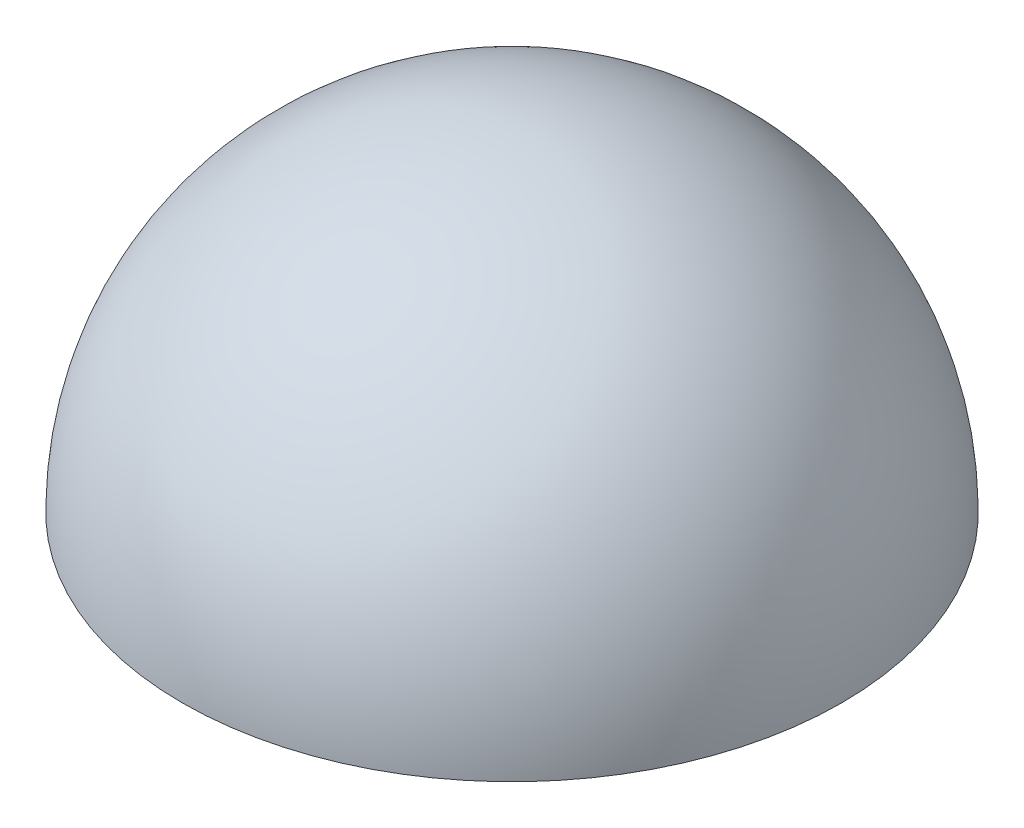
ISO-10303-21;
HEADER;
FILE_DESCRIPTION(('STEP AP214'),'2;1');
FILE_NAME('part.step','',(''),(''),'','','');
FILE_SCHEMA(('AUTOMOTIVE_DESIGN { 1 0 10303 214 1 1 1 1 }'));
ENDSEC;
DATA;
#1=APPLICATION_CONTEXT('core data for automotive mechanical design processes');
#2=APPLICATION_PROTOCOL_DEFINITION('international standard','automotive_design',2000,#1);
#3=PRODUCT_CONTEXT('',#1,'mechanical');
#4=PRODUCT('Part','Part','',(#3));
#5=PRODUCT_RELATED_PRODUCT_CATEGORY('part','',(#4));
#6=PRODUCT_DEFINITION_FORMATION('','',#4);
#7=PRODUCT_DEFINITION_CONTEXT('part definition',#1,'design');
#8=PRODUCT_DEFINITION('design','',#6,#7);
#9=PRODUCT_DEFINITION_SHAPE('','',#8);
#10=(LENGTH_UNIT() NAMED_UNIT(*) SI_UNIT(.MILLI.,.METRE.));
#11=(NAMED_UNIT(*) PLANE_ANGLE_UNIT() SI_UNIT($,.RADIAN.));
#12=(NAMED_UNIT(*) SI_UNIT($,.STERADIAN.) SOLID_ANGLE_UNIT());
#13=UNCERTAINTY_MEASURE_WITH_UNIT(LENGTH_MEASURE(1.E-05),#10,'distance_accuracy_value','');
#14=(GEOMETRIC_REPRESENTATION_CONTEXT(3) GLOBAL_UNCERTAINTY_ASSIGNED_CONTEXT((#13)) GLOBAL_UNIT_ASSIGNED_CONTEXT((#10,
#11,#12)) REPRESENTATION_CONTEXT('',''));
#15=CARTESIAN_POINT('',(0.,0.,0.));
#16=DIRECTION('',(0.,0.,1.));
#17=DIRECTION('',(1.,0.,0.));
#18=AXIS2_PLACEMENT_3D('',#15,#16,#17);
#19=CARTESIAN_POINT('',(0.,0.,0.));
#20=DIRECTION('',(0.,1.,0.));
#21=DIRECTION('',(1.,0.,0.));
#22=AXIS2_PLACEMENT_3D('',#19,#20,#21);
#23=SPHERICAL_SURFACE('',#22,29.);
#24=CARTESIAN_POINT('',(0.,0.,0.));
#25=DIRECTION('',(0.,1.,0.));
#26=DIRECTION('',(-1.,0.,0.));
#27=AXIS2_PLACEMENT_3D('',#24,#25,#26);
#28=CIRCLE('',#27,29.);
#29=CARTESIAN_POINT('',(-29.,0.,0.));
#30=VERTEX_POINT('',#29);
#31=EDGE_CURVE('E40',#30,#30,#28,.T.);
#32=ORIENTED_EDGE('',*,*,#31,.T.);
#33=EDGE_LOOP('',(#32));
#34=FACE_BOUND('',#33,.T.);
#35=ADVANCED_FACE('F34',(#34),#23,.T.);
#36=CARTESIAN_POINT('',(0.,0.,0.));
#37=DIRECTION('',(0.,1.,0.));
#38=DIRECTION('',(1.,0.,0.));
#39=AXIS2_PLACEMENT_3D('',#36,#37,#38);
#40=SPHERICAL_SURFACE('',#39,25.);
#41=CARTESIAN_POINT('',(0.,0.,0.));
#42=DIRECTION('',(0.,1.,0.));
#43=DIRECTION('',(-1.,0.,0.));
#44=AXIS2_PLACEMENT_3D('',#41,#42,#43);
#45=CIRCLE('',#44,25.);
#46=CARTESIAN_POINT('',(-25.,0.,0.));
#47=VERTEX_POINT('',#46);
#48=EDGE_CURVE('E10',#47,#47,#45,.T.);
#49=ORIENTED_EDGE('',*,*,#48,.F.);
#50=EDGE_LOOP('',(#49));
#51=FACE_BOUND('',#50,.T.);
#52=ADVANCED_FACE('F49',(#51),#40,.F.);
#53=CARTESIAN_POINT('',(25.,0.,0.));
#54=DIRECTION('',(0.,1.,0.));
#55=DIRECTION('',(-1.,0.,0.));
#56=AXIS2_PLACEMENT_3D('',#53,#54,#55);
#57=PLANE('',#56);
#58=ORIENTED_EDGE('',*,*,#31,.F.);
#59=EDGE_LOOP('',(#58));
#60=FACE_BOUND('',#59,.T.);
#61=ORIENTED_EDGE('',*,*,#48,.T.);
#62=EDGE_LOOP('',(#61));
#63=FACE_BOUND('',#62,.T.);
#64=ADVANCED_FACE('F47',(#60,#63),#57,.F.);
#65=CLOSED_SHELL('',(#35,#52,#64));
#66=MANIFOLD_SOLID_BREP('B2',#65);
#67=ADVANCED_BREP_SHAPE_REPRESENTATION('',(#18,#66),#14);
#68=SHAPE_DEFINITION_REPRESENTATION(#9,#67);
ENDSEC;
END-ISO-10303-21;
